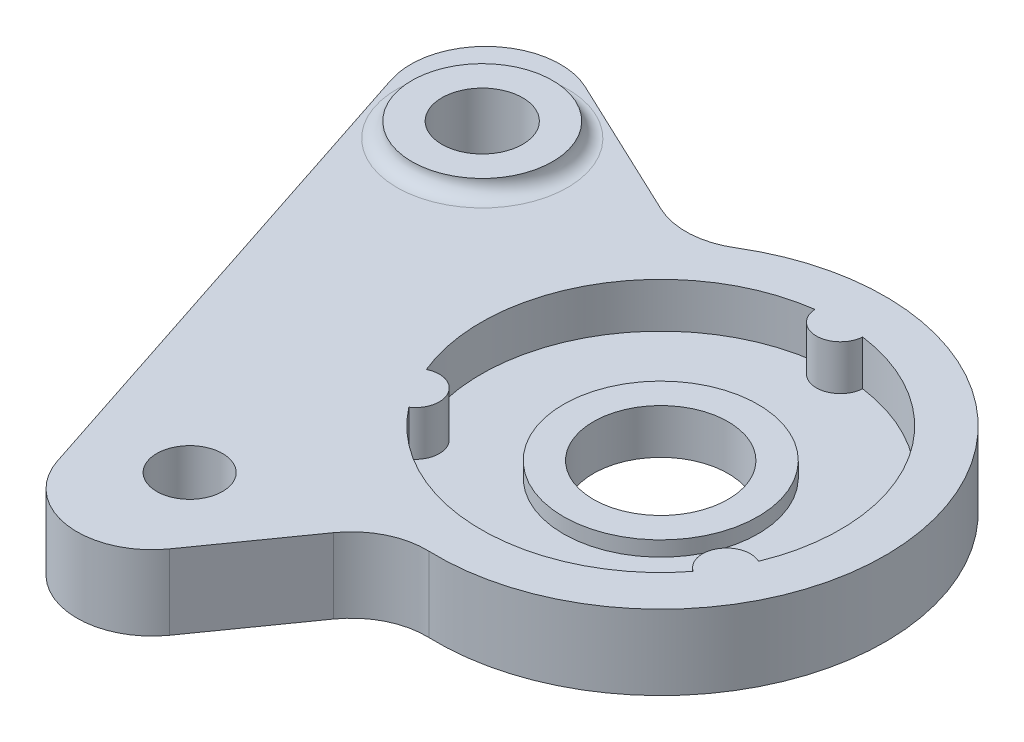
ISO-10303-21;
HEADER;
FILE_DESCRIPTION(('STEP AP214'),'2;1');
FILE_NAME('part.step','',(''),(''),'','','');
FILE_SCHEMA(('AUTOMOTIVE_DESIGN { 1 0 10303 214 1 1 1 1 }'));
ENDSEC;
DATA;
#1=APPLICATION_CONTEXT('core data for automotive mechanical design processes');
#2=APPLICATION_PROTOCOL_DEFINITION('international standard','automotive_design',2000,#1);
#3=PRODUCT_CONTEXT('',#1,'mechanical');
#4=PRODUCT('Part','Part','',(#3));
#5=PRODUCT_RELATED_PRODUCT_CATEGORY('part','',(#4));
#6=PRODUCT_DEFINITION_FORMATION('','',#4);
#7=PRODUCT_DEFINITION_CONTEXT('part definition',#1,'design');
#8=PRODUCT_DEFINITION('design','',#6,#7);
#9=PRODUCT_DEFINITION_SHAPE('','',#8);
#10=(LENGTH_UNIT() NAMED_UNIT(*) SI_UNIT(.MILLI.,.METRE.));
#11=(NAMED_UNIT(*) PLANE_ANGLE_UNIT() SI_UNIT($,.RADIAN.));
#12=(NAMED_UNIT(*) SI_UNIT($,.STERADIAN.) SOLID_ANGLE_UNIT());
#13=UNCERTAINTY_MEASURE_WITH_UNIT(LENGTH_MEASURE(1.E-05),#10,'distance_accuracy_value','');
#14=(GEOMETRIC_REPRESENTATION_CONTEXT(3) GLOBAL_UNCERTAINTY_ASSIGNED_CONTEXT((#13)) GLOBAL_UNIT_ASSIGNED_CONTEXT((#10,
#11,#12)) REPRESENTATION_CONTEXT('',''));
#15=CARTESIAN_POINT('',(0.,0.,0.));
#16=DIRECTION('',(0.,0.,1.));
#17=DIRECTION('',(1.,0.,0.));
#18=AXIS2_PLACEMENT_3D('',#15,#16,#17);
#19=CARTESIAN_POINT('',(0.,5.,0.));
#20=DIRECTION('',(0.,-1.,0.));
#21=DIRECTION('',(0.,0.,-1.));
#22=AXIS2_PLACEMENT_3D('',#19,#20,#21);
#23=CYLINDRICAL_SURFACE('',#22,12.);
#24=CARTESIAN_POINT('',(0.,5.,0.));
#25=DIRECTION('',(0.,1.,0.));
#26=DIRECTION('',(0.,0.,1.));
#27=AXIS2_PLACEMENT_3D('',#24,#25,#26);
#28=CIRCLE('',#27,12.);
#29=CARTESIAN_POINT('',(-1.59644048502354,5.,-11.8933333333333));
#30=VERTEX_POINT('',#29);
#31=CARTESIAN_POINT('',(-11.0981490448542,5.,4.56410865100746));
#32=VERTEX_POINT('',#31);
#33=EDGE_CURVE('E161',#30,#32,#28,.T.);
#34=ORIENTED_EDGE('',*,*,#33,.T.);
#35=DIRECTION('',(0.,-1.,0.));
#36=VECTOR('',#35,1.);
#37=CARTESIAN_POINT('',(-11.0981490448542,8.7279048689119,4.56410865100746));
#38=LINE('',#37,#36);
#39=CARTESIAN_POINT('',(-11.0981490448542,2.,4.56410865100746));
#40=VERTEX_POINT('',#39);
#41=EDGE_CURVE('E140',#32,#40,#38,.T.);
#42=ORIENTED_EDGE('',*,*,#41,.T.);
#43=CARTESIAN_POINT('',(0.,2.,0.));
#44=DIRECTION('',(0.,1.,0.));
#45=DIRECTION('',(0.,0.,1.));
#46=AXIS2_PLACEMENT_3D('',#43,#44,#45);
#47=CIRCLE('',#46,12.);
#48=CARTESIAN_POINT('',(-1.59644048502354,2.,-11.8933333333333));
#49=VERTEX_POINT('',#48);
#50=EDGE_CURVE('E200',#49,#40,#47,.T.);
#51=ORIENTED_EDGE('',*,*,#50,.F.);
#52=DIRECTION('',(0.,-1.,0.));
#53=VECTOR('',#52,1.);
#54=CARTESIAN_POINT('',(-1.59644048502354,8.7279048689119,-11.8933333333333));
#55=LINE('',#54,#53);
#56=EDGE_CURVE('E318',#30,#49,#55,.T.);
#57=ORIENTED_EDGE('',*,*,#56,.F.);
#58=EDGE_LOOP('',(#34,#42,#51,#57));
#59=FACE_BOUND('',#58,.T.);
#60=ADVANCED_FACE('F37',(#59),#23,.F.);
#61=CARTESIAN_POINT('',(-9.50170855983033,2.,7.32922468232806));
#62=VERTEX_POINT('',#61);
#63=CARTESIAN_POINT('',(9.50170855983194,2.,7.32922468232597));
#64=VERTEX_POINT('',#63);
#65=EDGE_CURVE('E154',#62,#64,#47,.T.);
#66=ORIENTED_EDGE('',*,*,#65,.F.);
#67=DIRECTION('',(0.,-1.,0.));
#68=VECTOR('',#67,1.);
#69=CARTESIAN_POINT('',(-9.50170855983033,8.7279048689119,7.32922468232806));
#70=LINE('',#69,#68);
#71=CARTESIAN_POINT('',(-9.50170855983033,5.,7.32922468232806));
#72=VERTEX_POINT('',#71);
#73=EDGE_CURVE('E52',#72,#62,#70,.T.);
#74=ORIENTED_EDGE('',*,*,#73,.F.);
#75=CARTESIAN_POINT('',(9.50170855983195,5.,7.32922468232596));
#76=VERTEX_POINT('',#75);
#77=EDGE_CURVE('E152',#72,#76,#28,.T.);
#78=ORIENTED_EDGE('',*,*,#77,.T.);
#79=DIRECTION('',(0.,-1.,0.));
#80=VECTOR('',#79,1.);
#81=CARTESIAN_POINT('',(9.50170855983194,8.7279048689119,7.32922468232597));
#82=LINE('',#81,#80);
#83=EDGE_CURVE('E145',#76,#64,#82,.T.);
#84=ORIENTED_EDGE('',*,*,#83,.T.);
#85=EDGE_LOOP('',(#66,#74,#78,#84));
#86=FACE_BOUND('',#85,.T.);
#87=ADVANCED_FACE('F150',(#86),#23,.F.);
#88=CARTESIAN_POINT('',(11.0981490448552,2.,4.56410865100517));
#89=VERTEX_POINT('',#88);
#90=CARTESIAN_POINT('',(1.59644048502354,2.,-11.8933333333333));
#91=VERTEX_POINT('',#90);
#92=EDGE_CURVE('E183',#89,#91,#47,.T.);
#93=ORIENTED_EDGE('',*,*,#92,.F.);
#94=DIRECTION('',(0.,-1.,0.));
#95=VECTOR('',#94,1.);
#96=CARTESIAN_POINT('',(11.0981490448552,8.7279048689119,4.56410865100517));
#97=LINE('',#96,#95);
#98=CARTESIAN_POINT('',(11.0981490448552,5.,4.56410865100517));
#99=VERTEX_POINT('',#98);
#100=EDGE_CURVE('E60',#99,#89,#97,.T.);
#101=ORIENTED_EDGE('',*,*,#100,.F.);
#102=CARTESIAN_POINT('',(1.59644048502355,5.,-11.8933333333333));
#103=VERTEX_POINT('',#102);
#104=EDGE_CURVE('E162',#99,#103,#28,.T.);
#105=ORIENTED_EDGE('',*,*,#104,.T.);
#106=DIRECTION('',(0.,-1.,0.));
#107=VECTOR('',#106,1.);
#108=CARTESIAN_POINT('',(1.59644048502354,8.7279048689119,-11.8933333333333));
#109=LINE('',#108,#107);
#110=EDGE_CURVE('E303',#103,#91,#109,.T.);
#111=ORIENTED_EDGE('',*,*,#110,.T.);
#112=EDGE_LOOP('',(#93,#101,#105,#111));
#113=FACE_BOUND('',#112,.T.);
#114=ADVANCED_FACE('F289',(#113),#23,.F.);
#115=CARTESIAN_POINT('',(4.89755338496311,5.,3.4661175458193));
#116=DIRECTION('',(0.816258897493851,0.,0.57768625763655));
#117=DIRECTION('',(0.57768625763655,0.,-0.816258897493851));
#118=AXIS2_PLACEMENT_3D('',#115,#116,#117);
#119=PLANE('',#118);
#120=DIRECTION('',(-0.57768625763655,0.,0.816258897493851));
#121=VECTOR('',#120,1.);
#122=CARTESIAN_POINT('',(4.89755338496311,0.,3.4661175458193));
#123=LINE('',#122,#121);
#124=CARTESIAN_POINT('',(-4.75170948953318,0.,17.1003291467469));
#125=VERTEX_POINT('',#124);
#126=CARTESIAN_POINT('',(-9.29348969687176,0.,23.5177719293896));
#127=VERTEX_POINT('',#126);
#128=EDGE_CURVE('E184',#125,#127,#123,.T.);
#129=ORIENTED_EDGE('',*,*,#128,.F.);
#130=DIRECTION('',(0.,-1.,0.));
#131=VECTOR('',#130,1.);
#132=CARTESIAN_POINT('',(-4.75170948953318,5.,17.1003291467469));
#133=LINE('',#132,#131);
#134=CARTESIAN_POINT('',(-4.75170948953318,5.,17.1003291467469));
#135=VERTEX_POINT('',#134);
#136=EDGE_CURVE('E230',#125,#135,#133,.F.);
#137=ORIENTED_EDGE('',*,*,#136,.T.);
#138=DIRECTION('',(-0.57768625763655,0.,0.816258897493851));
#139=VECTOR('',#138,1.);
#140=CARTESIAN_POINT('',(4.89755338496311,5.,3.4661175458193));
#141=LINE('',#140,#139);
#142=CARTESIAN_POINT('',(-9.29348969687176,5.,23.5177719293896));
#143=VERTEX_POINT('',#142);
#144=EDGE_CURVE('E164',#135,#143,#141,.T.);
#145=ORIENTED_EDGE('',*,*,#144,.T.);
#146=DIRECTION('',(0.,-1.,0.));
#147=VECTOR('',#146,1.);
#148=CARTESIAN_POINT('',(-9.29348969687176,5.,23.5177719293896));
#149=LINE('',#148,#147);
#150=EDGE_CURVE('E219',#143,#127,#149,.T.);
#151=ORIENTED_EDGE('',*,*,#150,.T.);
#152=EDGE_LOOP('',(#129,#137,#145,#151));
#153=FACE_BOUND('',#152,.T.);
#154=ADVANCED_FACE('F257',(#153),#119,.T.);
#155=CARTESIAN_POINT('',(0.,5.,0.));
#156=DIRECTION('',(0.,-1.,0.));
#157=DIRECTION('',(0.,0.,-1.));
#158=AXIS2_PLACEMENT_3D('',#155,#156,#157);
#159=CYLINDRICAL_SURFACE('',#158,15.);
#160=CARTESIAN_POINT('',(0.,0.,0.));
#161=DIRECTION('',(0.,1.,0.));
#162=DIRECTION('',(0.,0.,1.));
#163=AXIS2_PLACEMENT_3D('',#160,#161,#162);
#164=CIRCLE('',#163,15.);
#165=CARTESIAN_POINT('',(-0.502811251547942,0.,14.9915703261972));
#166=VERTEX_POINT('',#165);
#167=CARTESIAN_POINT('',(-7.8028543625734,0.,-12.8107557855292));
#168=VERTEX_POINT('',#167);
#169=EDGE_CURVE('E186',#166,#168,#164,.T.);
#170=ORIENTED_EDGE('',*,*,#169,.T.);
#171=DIRECTION('',(0.,-1.,0.));
#172=VECTOR('',#171,1.);
#173=CARTESIAN_POINT('',(-7.8028543625734,5.,-12.8107557855292));
#174=LINE('',#173,#172);
#175=CARTESIAN_POINT('',(-7.8028543625734,5.,-12.8107557855292));
#176=VERTEX_POINT('',#175);
#177=EDGE_CURVE('E228',#168,#176,#174,.F.);
#178=ORIENTED_EDGE('',*,*,#177,.T.);
#179=CARTESIAN_POINT('',(0.,5.,0.));
#180=DIRECTION('',(0.,1.,0.));
#181=DIRECTION('',(0.,0.,1.));
#182=AXIS2_PLACEMENT_3D('',#179,#180,#181);
#183=CIRCLE('',#182,15.);
#184=CARTESIAN_POINT('',(-0.502811251547942,5.,14.9915703261972));
#185=VERTEX_POINT('',#184);
#186=EDGE_CURVE('E171',#185,#176,#183,.T.);
#187=ORIENTED_EDGE('',*,*,#186,.F.);
#188=DIRECTION('',(0.,-1.,0.));
#189=VECTOR('',#188,1.);
#190=CARTESIAN_POINT('',(-0.502811251547942,5.,14.9915703261972));
#191=LINE('',#190,#189);
#192=EDGE_CURVE('E225',#185,#166,#191,.T.);
#193=ORIENTED_EDGE('',*,*,#192,.T.);
#194=EDGE_LOOP('',(#170,#178,#187,#193));
#195=FACE_BOUND('',#194,.T.);
#196=ADVANCED_FACE('F247',(#195),#159,.T.);
#197=CARTESIAN_POINT('',(2.56300821164913,5.,-5.42503353971376));
#198=DIRECTION('',(0.427168035274854,0.,-0.904172256618959));
#199=DIRECTION('',(-0.904172256618959,0.,-0.427168035274854));
#200=AXIS2_PLACEMENT_3D('',#197,#198,#199);
#201=PLANE('',#200);
#202=DIRECTION('',(0.904172256618959,0.,0.427168035274854));
#203=VECTOR('',#202,1.);
#204=CARTESIAN_POINT('',(2.56300821164913,5.,-5.42503353971376));
#205=LINE('',#204,#203);
#206=CARTESIAN_POINT('',(-22.1442331079006,5.,-17.097747067775));
#207=VERTEX_POINT('',#206);
#208=CARTESIAN_POINT('',(-12.5396459931388,5.,-12.5601464309441));
#209=VERTEX_POINT('',#208);
#210=EDGE_CURVE('E174',#207,#209,#205,.T.);
#211=ORIENTED_EDGE('',*,*,#210,.T.);
#212=DIRECTION('',(0.,-1.,0.));
#213=VECTOR('',#212,1.);
#214=CARTESIAN_POINT('',(-12.5396459931388,5.,-12.5601464309441));
#215=LINE('',#214,#213);
#216=CARTESIAN_POINT('',(-12.5396459931388,0.,-12.5601464309441));
#217=VERTEX_POINT('',#216);
#218=EDGE_CURVE('E222',#209,#217,#215,.T.);
#219=ORIENTED_EDGE('',*,*,#218,.T.);
#220=DIRECTION('',(0.904172256618959,0.,0.427168035274854));
#221=VECTOR('',#220,1.);
#222=CARTESIAN_POINT('',(2.56300821164913,0.,-5.42503353971376));
#223=LINE('',#222,#221);
#224=CARTESIAN_POINT('',(-22.1442331079006,0.,-17.097747067775));
#225=VERTEX_POINT('',#224);
#226=EDGE_CURVE('E189',#225,#217,#223,.T.);
#227=ORIENTED_EDGE('',*,*,#226,.F.);
#228=DIRECTION('',(0.,-1.,0.));
#229=VECTOR('',#228,1.);
#230=CARTESIAN_POINT('',(-22.1442331079006,5.,-17.097747067775));
#231=LINE('',#230,#229);
#232=EDGE_CURVE('E212',#225,#207,#231,.F.);
#233=ORIENTED_EDGE('',*,*,#232,.T.);
#234=EDGE_LOOP('',(#211,#219,#227,#233));
#235=FACE_BOUND('',#234,.T.);
#236=ADVANCED_FACE('F274',(#235),#201,.T.);
#237=CARTESIAN_POINT('',(-13.0441556974333,5.,18.4311259054112));
#238=DIRECTION('',(0.,-1.,0.));
#239=DIRECTION('',(0.,0.,-1.));
#240=AXIS2_PLACEMENT_3D('',#237,#238,#239);
#241=CYLINDRICAL_SURFACE('',#240,2.2);
#242=CARTESIAN_POINT('',(-13.0441556974333,5.,18.4311259054112));
#243=DIRECTION('',(0.,1.,0.));
#244=DIRECTION('',(0.,0.,1.));
#245=AXIS2_PLACEMENT_3D('',#242,#243,#244);
#246=CIRCLE('',#245,2.2);
#247=CARTESIAN_POINT('',(-13.0441556974333,5.,20.6311259054112));
#248=VERTEX_POINT('',#247);
#249=EDGE_CURVE('E180',#248,#248,#246,.T.);
#250=ORIENTED_EDGE('',*,*,#249,.T.);
#251=EDGE_LOOP('',(#250));
#252=FACE_BOUND('',#251,.T.);
#253=CARTESIAN_POINT('',(-13.0441556974333,0.,18.4311259054112));
#254=DIRECTION('',(0.,1.,0.));
#255=DIRECTION('',(0.,0.,1.));
#256=AXIS2_PLACEMENT_3D('',#253,#254,#255);
#257=CIRCLE('',#256,2.2);
#258=CARTESIAN_POINT('',(-13.0441556974333,0.,20.6311259054112));
#259=VERTEX_POINT('',#258);
#260=EDGE_CURVE('E195',#259,#259,#257,.T.);
#261=ORIENTED_EDGE('',*,*,#260,.F.);
#262=EDGE_LOOP('',(#261));
#263=FACE_BOUND('',#262,.T.);
#264=ADVANCED_FACE('F377',(#252,#263),#241,.F.);
#265=CARTESIAN_POINT('',(-22.9384223712889,5.,7.53322958914367));
#266=DIRECTION('',(-0.950076947783487,0.,0.31201569398095));
#267=DIRECTION('',(0.31201569398095,0.,0.950076947783487));
#268=AXIS2_PLACEMENT_3D('',#265,#266,#267);
#269=PLANE('',#268);
#270=DIRECTION('',(-0.31201569398095,0.,-0.950076947783487));
#271=VECTOR('',#270,1.);
#272=CARTESIAN_POINT('',(-22.9384223712889,5.,7.53322958914367));
#273=LINE('',#272,#271);
#274=CARTESIAN_POINT('',(-18.1251689232584,5.,22.1894191111116));
#275=VERTEX_POINT('',#274);
#276=CARTESIAN_POINT('',(-29.0304580231923,5.,-11.0168073147754));
#277=VERTEX_POINT('',#276);
#278=EDGE_CURVE('E177',#275,#277,#273,.T.);
#279=ORIENTED_EDGE('',*,*,#278,.T.);
#280=DIRECTION('',(0.,-1.,0.));
#281=VECTOR('',#280,1.);
#282=CARTESIAN_POINT('',(-29.0304580231923,5.,-11.0168073147754));
#283=LINE('',#282,#281);
#284=CARTESIAN_POINT('',(-29.0304580231923,0.,-11.0168073147754));
#285=VERTEX_POINT('',#284);
#286=EDGE_CURVE('E205',#277,#285,#283,.T.);
#287=ORIENTED_EDGE('',*,*,#286,.T.);
#288=DIRECTION('',(-0.31201569398095,0.,-0.950076947783487));
#289=VECTOR('',#288,1.);
#290=CARTESIAN_POINT('',(-22.9384223712889,0.,7.53322958914367));
#291=LINE('',#290,#289);
#292=CARTESIAN_POINT('',(-18.1251689232584,0.,22.1894191111116));
#293=VERTEX_POINT('',#292);
#294=EDGE_CURVE('E192',#293,#285,#291,.T.);
#295=ORIENTED_EDGE('',*,*,#294,.F.);
#296=DIRECTION('',(0.,-1.,0.));
#297=VECTOR('',#296,1.);
#298=CARTESIAN_POINT('',(-18.1251689232584,5.,22.1894191111116));
#299=LINE('',#298,#297);
#300=EDGE_CURVE('E203',#293,#275,#299,.F.);
#301=ORIENTED_EDGE('',*,*,#300,.T.);
#302=EDGE_LOOP('',(#279,#287,#295,#301));
#303=FACE_BOUND('',#302,.T.);
#304=ADVANCED_FACE('F265',(#303),#269,.T.);
#305=CARTESIAN_POINT('',(-22.604306415474,5.,-10.6792008818714));
#306=DIRECTION('',(0.,-1.,0.));
#307=DIRECTION('',(0.,0.,-1.));
#308=AXIS2_PLACEMENT_3D('',#305,#306,#307);
#309=CYLINDRICAL_SURFACE('',#308,2.7);
#310=CARTESIAN_POINT('',(-22.604306415474,0.,-10.6792008818714));
#311=DIRECTION('',(0.,1.,0.));
#312=DIRECTION('',(0.,0.,1.));
#313=AXIS2_PLACEMENT_3D('',#310,#311,#312);
#314=CIRCLE('',#313,2.7);
#315=CARTESIAN_POINT('',(-22.604306415474,0.,-7.97920088187135));
#316=VERTEX_POINT('',#315);
#317=EDGE_CURVE('E165',#316,#316,#314,.T.);
#318=ORIENTED_EDGE('',*,*,#317,.F.);
#319=EDGE_LOOP('',(#318));
#320=FACE_BOUND('',#319,.T.);
#321=CARTESIAN_POINT('',(-22.604306415474,6.,-10.6792008818714));
#322=DIRECTION('',(0.,1.,0.));
#323=DIRECTION('',(0.,0.,1.));
#324=AXIS2_PLACEMENT_3D('',#321,#322,#323);
#325=CIRCLE('',#324,2.7);
#326=CARTESIAN_POINT('',(-22.604306415474,6.,-7.97920088187135));
#327=VERTEX_POINT('',#326);
#328=EDGE_CURVE('E330',#327,#327,#325,.F.);
#329=ORIENTED_EDGE('',*,*,#328,.F.);
#330=EDGE_LOOP('',(#329));
#331=FACE_BOUND('',#330,.T.);
#332=ADVANCED_FACE('F370',(#320,#331),#309,.F.);
#333=CARTESIAN_POINT('',(0.,5.,0.));
#334=DIRECTION('',(0.,1.,0.));
#335=DIRECTION('',(0.,0.,1.));
#336=AXIS2_PLACEMENT_3D('',#333,#334,#335);
#337=PLANE('',#336);
#338=CARTESIAN_POINT('',(-22.604306415474,5.,-10.6792008818714));
#339=DIRECTION('',(0.,1.,0.));
#340=DIRECTION('',(0.,0.,1.));
#341=AXIS2_PLACEMENT_3D('',#338,#339,#340);
#342=CIRCLE('',#341,5.7);
#343=CARTESIAN_POINT('',(-22.604306415474,5.,-4.97920088187135));
#344=VERTEX_POINT('',#343);
#345=EDGE_CURVE('E11',#344,#344,#342,.F.);
#346=ORIENTED_EDGE('',*,*,#345,.T.);
#347=EDGE_LOOP('',(#346));
#348=FACE_BOUND('',#347,.T.);
#349=ORIENTED_EDGE('',*,*,#33,.F.);
#350=CARTESIAN_POINT('',(0.,5.,-12.));
#351=DIRECTION('',(0.,1.,0.));
#352=DIRECTION('',(0.,0.,1.));
#353=AXIS2_PLACEMENT_3D('',#350,#351,#352);
#354=CIRCLE('',#353,1.6);
#355=EDGE_CURVE('E317',#30,#103,#354,.T.);
#356=ORIENTED_EDGE('',*,*,#355,.T.);
#357=ORIENTED_EDGE('',*,*,#104,.F.);
#358=CARTESIAN_POINT('',(10.3923048454145,5.,5.99999999999926));
#359=DIRECTION('',(0.,1.,0.));
#360=DIRECTION('',(0.,0.,1.));
#361=AXIS2_PLACEMENT_3D('',#358,#359,#360);
#362=CIRCLE('',#361,1.6);
#363=EDGE_CURVE('E160',#99,#76,#362,.T.);
#364=ORIENTED_EDGE('',*,*,#363,.T.);
#365=ORIENTED_EDGE('',*,*,#77,.F.);
#366=CARTESIAN_POINT('',(-10.392304845412,5.,6.00000000000074));
#367=DIRECTION('',(0.,1.,0.));
#368=DIRECTION('',(0.,0.,1.));
#369=AXIS2_PLACEMENT_3D('',#366,#367,#368);
#370=CIRCLE('',#369,1.6);
#371=EDGE_CURVE('E137',#72,#32,#370,.T.);
#372=ORIENTED_EDGE('',*,*,#371,.T.);
#373=EDGE_LOOP('',(#349,#356,#357,#364,#365,#372));
#374=FACE_BOUND('',#373,.T.);
#375=ORIENTED_EDGE('',*,*,#210,.F.);
#376=CARTESIAN_POINT('',(-24.2800732842749,5.,-12.5768857846802));
#377=DIRECTION('',(0.,1.,0.));
#378=DIRECTION('',(0.,0.,1.));
#379=AXIS2_PLACEMENT_3D('',#376,#377,#378);
#380=CIRCLE('',#379,5.);
#381=EDGE_CURVE('E217',#207,#277,#380,.T.);
#382=ORIENTED_EDGE('',*,*,#381,.T.);
#383=ORIENTED_EDGE('',*,*,#278,.F.);
#384=CARTESIAN_POINT('',(-13.374784184341,5.,20.6293406412069));
#385=DIRECTION('',(0.,1.,0.));
#386=DIRECTION('',(0.,0.,1.));
#387=AXIS2_PLACEMENT_3D('',#384,#385,#386);
#388=CIRCLE('',#387,5.);
#389=EDGE_CURVE('E214',#275,#143,#388,.T.);
#390=ORIENTED_EDGE('',*,*,#389,.T.);
#391=ORIENTED_EDGE('',*,*,#144,.F.);
#392=CARTESIAN_POINT('',(-0.670415002063923,5.,19.9887604349296));
#393=DIRECTION('',(0.,1.,0.));
#394=DIRECTION('',(0.,0.,1.));
#395=AXIS2_PLACEMENT_3D('',#392,#393,#394);
#396=CIRCLE('',#395,5.);
#397=EDGE_CURVE('E45',#135,#185,#396,.F.);
#398=ORIENTED_EDGE('',*,*,#397,.T.);
#399=ORIENTED_EDGE('',*,*,#186,.T.);
#400=CARTESIAN_POINT('',(-10.4038058167645,5.,-17.0810077140389));
#401=DIRECTION('',(0.,1.,0.));
#402=DIRECTION('',(0.,0.,1.));
#403=AXIS2_PLACEMENT_3D('',#400,#401,#402);
#404=CIRCLE('',#403,5.);
#405=EDGE_CURVE('E234',#176,#209,#404,.F.);
#406=ORIENTED_EDGE('',*,*,#405,.T.);
#407=EDGE_LOOP('',(#375,#382,#383,#390,#391,#398,#399,#406));
#408=FACE_BOUND('',#407,.T.);
#409=ORIENTED_EDGE('',*,*,#249,.F.);
#410=EDGE_LOOP('',(#409));
#411=FACE_BOUND('',#410,.T.);
#412=ADVANCED_FACE('F157',(#348,#374,#408,#411),#337,.T.);
#413=CARTESIAN_POINT('',(0.,0.,0.));
#414=DIRECTION('',(0.,1.,0.));
#415=DIRECTION('',(0.,0.,1.));
#416=AXIS2_PLACEMENT_3D('',#413,#414,#415);
#417=PLANE('',#416);
#418=ORIENTED_EDGE('',*,*,#294,.T.);
#419=CARTESIAN_POINT('',(-24.2800732842749,0.,-12.5768857846802));
#420=DIRECTION('',(0.,1.,0.));
#421=DIRECTION('',(0.,0.,1.));
#422=AXIS2_PLACEMENT_3D('',#419,#420,#421);
#423=CIRCLE('',#422,5.);
#424=EDGE_CURVE('E210',#285,#225,#423,.F.);
#425=ORIENTED_EDGE('',*,*,#424,.T.);
#426=ORIENTED_EDGE('',*,*,#226,.T.);
#427=CARTESIAN_POINT('',(-10.4038058167645,0.,-17.0810077140389));
#428=DIRECTION('',(0.,1.,0.));
#429=DIRECTION('',(0.,0.,1.));
#430=AXIS2_PLACEMENT_3D('',#427,#428,#429);
#431=CIRCLE('',#430,5.);
#432=EDGE_CURVE('E232',#217,#168,#431,.T.);
#433=ORIENTED_EDGE('',*,*,#432,.T.);
#434=ORIENTED_EDGE('',*,*,#169,.F.);
#435=CARTESIAN_POINT('',(-0.670415002063923,0.,19.9887604349296));
#436=DIRECTION('',(0.,1.,0.));
#437=DIRECTION('',(0.,0.,1.));
#438=AXIS2_PLACEMENT_3D('',#435,#436,#437);
#439=CIRCLE('',#438,5.);
#440=EDGE_CURVE('E236',#166,#125,#439,.T.);
#441=ORIENTED_EDGE('',*,*,#440,.T.);
#442=ORIENTED_EDGE('',*,*,#128,.T.);
#443=CARTESIAN_POINT('',(-13.374784184341,0.,20.6293406412069));
#444=DIRECTION('',(0.,1.,0.));
#445=DIRECTION('',(0.,0.,1.));
#446=AXIS2_PLACEMENT_3D('',#443,#444,#445);
#447=CIRCLE('',#446,5.);
#448=EDGE_CURVE('E208',#127,#293,#447,.F.);
#449=ORIENTED_EDGE('',*,*,#448,.T.);
#450=EDGE_LOOP('',(#418,#425,#426,#433,#434,#441,#442,#449));
#451=FACE_BOUND('',#450,.T.);
#452=ORIENTED_EDGE('',*,*,#260,.T.);
#453=EDGE_LOOP('',(#452));
#454=FACE_BOUND('',#453,.T.);
#455=ORIENTED_EDGE('',*,*,#317,.T.);
#456=EDGE_LOOP('',(#455));
#457=FACE_BOUND('',#456,.T.);
#458=CARTESIAN_POINT('',(0.,0.,0.));
#459=DIRECTION('',(0.,1.,0.));
#460=DIRECTION('',(0.,0.,1.));
#461=AXIS2_PLACEMENT_3D('',#458,#459,#460);
#462=CIRCLE('',#461,4.5);
#463=CARTESIAN_POINT('',(0.,0.,4.5));
#464=VERTEX_POINT('',#463);
#465=EDGE_CURVE('E168',#464,#464,#462,.T.);
#466=ORIENTED_EDGE('',*,*,#465,.T.);
#467=EDGE_LOOP('',(#466));
#468=FACE_BOUND('',#467,.T.);
#469=ADVANCED_FACE('F253',(#451,#454,#457,#468),#417,.F.);
#470=CARTESIAN_POINT('',(0.,2.,0.));
#471=DIRECTION('',(0.,-1.,0.));
#472=DIRECTION('',(0.,0.,-1.));
#473=AXIS2_PLACEMENT_3D('',#470,#471,#472);
#474=CYLINDRICAL_SURFACE('',#473,4.5);
#475=ORIENTED_EDGE('',*,*,#465,.F.);
#476=EDGE_LOOP('',(#475));
#477=FACE_BOUND('',#476,.T.);
#478=CARTESIAN_POINT('',(0.,3.,0.));
#479=DIRECTION('',(0.,1.,0.));
#480=DIRECTION('',(0.,0.,1.));
#481=AXIS2_PLACEMENT_3D('',#478,#479,#480);
#482=CIRCLE('',#481,4.5);
#483=CARTESIAN_POINT('',(0.,3.,4.5));
#484=VERTEX_POINT('',#483);
#485=EDGE_CURVE('E324',#484,#484,#482,.F.);
#486=ORIENTED_EDGE('',*,*,#485,.F.);
#487=EDGE_LOOP('',(#486));
#488=FACE_BOUND('',#487,.T.);
#489=ADVANCED_FACE('F342',(#477,#488),#474,.F.);
#490=CARTESIAN_POINT('',(0.,2.,0.));
#491=DIRECTION('',(0.,1.,0.));
#492=DIRECTION('',(0.,0.,1.));
#493=AXIS2_PLACEMENT_3D('',#490,#491,#492);
#494=PLANE('',#493);
#495=CARTESIAN_POINT('',(0.,2.,0.));
#496=DIRECTION('',(0.,1.,0.));
#497=DIRECTION('',(0.,0.,1.));
#498=AXIS2_PLACEMENT_3D('',#495,#496,#497);
#499=CIRCLE('',#498,6.5);
#500=CARTESIAN_POINT('',(0.,2.,6.5));
#501=VERTEX_POINT('',#500);
#502=EDGE_CURVE('E321',#501,#501,#499,.T.);
#503=ORIENTED_EDGE('',*,*,#502,.F.);
#504=EDGE_LOOP('',(#503));
#505=FACE_BOUND('',#504,.T.);
#506=ORIENTED_EDGE('',*,*,#50,.T.);
#507=CARTESIAN_POINT('',(-10.392304845412,2.,6.00000000000074));
#508=DIRECTION('',(0.,1.,0.));
#509=DIRECTION('',(0.,0.,1.));
#510=AXIS2_PLACEMENT_3D('',#507,#508,#509);
#511=CIRCLE('',#510,1.6);
#512=EDGE_CURVE('E146',#62,#40,#511,.T.);
#513=ORIENTED_EDGE('',*,*,#512,.F.);
#514=ORIENTED_EDGE('',*,*,#65,.T.);
#515=CARTESIAN_POINT('',(10.3923048454145,2.,5.99999999999926));
#516=DIRECTION('',(0.,1.,0.));
#517=DIRECTION('',(0.,0.,1.));
#518=AXIS2_PLACEMENT_3D('',#515,#516,#517);
#519=CIRCLE('',#518,1.6);
#520=EDGE_CURVE('E308',#89,#64,#519,.T.);
#521=ORIENTED_EDGE('',*,*,#520,.F.);
#522=ORIENTED_EDGE('',*,*,#92,.T.);
#523=CARTESIAN_POINT('',(0.,2.,-12.));
#524=DIRECTION('',(0.,1.,0.));
#525=DIRECTION('',(0.,0.,1.));
#526=AXIS2_PLACEMENT_3D('',#523,#524,#525);
#527=CIRCLE('',#526,1.6);
#528=EDGE_CURVE('E315',#49,#91,#527,.T.);
#529=ORIENTED_EDGE('',*,*,#528,.F.);
#530=EDGE_LOOP('',(#506,#513,#514,#521,#522,#529));
#531=FACE_BOUND('',#530,.T.);
#532=ADVANCED_FACE('F307',(#505,#531),#494,.T.);
#533=CARTESIAN_POINT('',(-24.2800732842749,5.,-12.5768857846802));
#534=DIRECTION('',(0.,-1.,0.));
#535=DIRECTION('',(0.,0.,-1.));
#536=AXIS2_PLACEMENT_3D('',#533,#534,#535);
#537=CYLINDRICAL_SURFACE('',#536,5.);
#538=ORIENTED_EDGE('',*,*,#381,.F.);
#539=ORIENTED_EDGE('',*,*,#232,.F.);
#540=ORIENTED_EDGE('',*,*,#424,.F.);
#541=ORIENTED_EDGE('',*,*,#286,.F.);
#542=EDGE_LOOP('',(#538,#539,#540,#541));
#543=FACE_BOUND('',#542,.T.);
#544=ADVANCED_FACE('F270',(#543),#537,.T.);
#545=CARTESIAN_POINT('',(-13.374784184341,5.,20.6293406412069));
#546=DIRECTION('',(0.,-1.,0.));
#547=DIRECTION('',(0.,0.,-1.));
#548=AXIS2_PLACEMENT_3D('',#545,#546,#547);
#549=CYLINDRICAL_SURFACE('',#548,5.);
#550=ORIENTED_EDGE('',*,*,#389,.F.);
#551=ORIENTED_EDGE('',*,*,#300,.F.);
#552=ORIENTED_EDGE('',*,*,#448,.F.);
#553=ORIENTED_EDGE('',*,*,#150,.F.);
#554=EDGE_LOOP('',(#550,#551,#552,#553));
#555=FACE_BOUND('',#554,.T.);
#556=ADVANCED_FACE('F261',(#555),#549,.T.);
#557=CARTESIAN_POINT('',(-10.4038058167645,5.,-17.0810077140389));
#558=DIRECTION('',(0.,-1.,0.));
#559=DIRECTION('',(0.,0.,-1.));
#560=AXIS2_PLACEMENT_3D('',#557,#558,#559);
#561=CYLINDRICAL_SURFACE('',#560,5.);
#562=ORIENTED_EDGE('',*,*,#405,.F.);
#563=ORIENTED_EDGE('',*,*,#177,.F.);
#564=ORIENTED_EDGE('',*,*,#432,.F.);
#565=ORIENTED_EDGE('',*,*,#218,.F.);
#566=EDGE_LOOP('',(#562,#563,#564,#565));
#567=FACE_BOUND('',#566,.T.);
#568=ADVANCED_FACE('F277',(#567),#561,.F.);
#569=CARTESIAN_POINT('',(-0.670415002063923,5.,19.9887604349296));
#570=DIRECTION('',(0.,-1.,0.));
#571=DIRECTION('',(0.,0.,-1.));
#572=AXIS2_PLACEMENT_3D('',#569,#570,#571);
#573=CYLINDRICAL_SURFACE('',#572,5.);
#574=ORIENTED_EDGE('',*,*,#397,.F.);
#575=ORIENTED_EDGE('',*,*,#136,.F.);
#576=ORIENTED_EDGE('',*,*,#440,.F.);
#577=ORIENTED_EDGE('',*,*,#192,.F.);
#578=EDGE_LOOP('',(#574,#575,#576,#577));
#579=FACE_BOUND('',#578,.T.);
#580=ADVANCED_FACE('F250',(#579),#573,.F.);
#581=CARTESIAN_POINT('',(0.,6.,0.));
#582=DIRECTION('',(0.,1.,0.));
#583=DIRECTION('',(0.,0.,1.));
#584=AXIS2_PLACEMENT_3D('',#581,#582,#583);
#585=PLANE('',#584);
#586=ORIENTED_EDGE('',*,*,#328,.T.);
#587=EDGE_LOOP('',(#586));
#588=FACE_BOUND('',#587,.T.);
#589=CARTESIAN_POINT('',(-22.604306415474,6.,-10.6792008818714));
#590=DIRECTION('',(0.,1.,0.));
#591=DIRECTION('',(0.,0.,1.));
#592=AXIS2_PLACEMENT_3D('',#589,#590,#591);
#593=CIRCLE('',#592,4.7);
#594=CARTESIAN_POINT('',(-22.604306415474,6.,-5.97920088187135));
#595=VERTEX_POINT('',#594);
#596=EDGE_CURVE('E334',#595,#595,#593,.T.);
#597=ORIENTED_EDGE('',*,*,#596,.T.);
#598=EDGE_LOOP('',(#597));
#599=FACE_BOUND('',#598,.T.);
#600=ADVANCED_FACE('F284',(#588,#599),#585,.T.);
#601=CARTESIAN_POINT('',(-22.604306415474,6.,-10.6792008818714));
#602=DIRECTION('',(0.,1.,0.));
#603=DIRECTION('',(0.,0.,1.));
#604=AXIS2_PLACEMENT_3D('',#601,#602,#603);
#605=TOROIDAL_SURFACE('',#604,5.7,1.);
#606=ORIENTED_EDGE('',*,*,#345,.F.);
#607=EDGE_LOOP('',(#606));
#608=FACE_BOUND('',#607,.T.);
#609=ORIENTED_EDGE('',*,*,#596,.F.);
#610=EDGE_LOOP('',(#609));
#611=FACE_BOUND('',#610,.T.);
#612=ADVANCED_FACE('F39',(#608,#611),#605,.F.);
#613=CARTESIAN_POINT('',(0.,3.,0.));
#614=DIRECTION('',(0.,-1.,0.));
#615=DIRECTION('',(0.,0.,-1.));
#616=AXIS2_PLACEMENT_3D('',#613,#614,#615);
#617=CYLINDRICAL_SURFACE('',#616,6.5);
#618=CARTESIAN_POINT('',(0.,3.,0.));
#619=DIRECTION('',(0.,1.,0.));
#620=DIRECTION('',(0.,0.,1.));
#621=AXIS2_PLACEMENT_3D('',#618,#619,#620);
#622=CIRCLE('',#621,6.5);
#623=CARTESIAN_POINT('',(0.,3.,6.5));
#624=VERTEX_POINT('',#623);
#625=EDGE_CURVE('E327',#624,#624,#622,.T.);
#626=ORIENTED_EDGE('',*,*,#625,.F.);
#627=EDGE_LOOP('',(#626));
#628=FACE_BOUND('',#627,.T.);
#629=ORIENTED_EDGE('',*,*,#502,.T.);
#630=EDGE_LOOP('',(#629));
#631=FACE_BOUND('',#630,.T.);
#632=ADVANCED_FACE('F352',(#628,#631),#617,.T.);
#633=CARTESIAN_POINT('',(0.,3.,0.));
#634=DIRECTION('',(0.,1.,0.));
#635=DIRECTION('',(0.,0.,1.));
#636=AXIS2_PLACEMENT_3D('',#633,#634,#635);
#637=PLANE('',#636);
#638=ORIENTED_EDGE('',*,*,#485,.T.);
#639=EDGE_LOOP('',(#638));
#640=FACE_BOUND('',#639,.T.);
#641=ORIENTED_EDGE('',*,*,#625,.T.);
#642=EDGE_LOOP('',(#641));
#643=FACE_BOUND('',#642,.T.);
#644=ADVANCED_FACE('F348',(#640,#643),#637,.T.);
#645=CARTESIAN_POINT('',(0.,8.7279048689119,-12.));
#646=DIRECTION('',(0.,-1.,0.));
#647=DIRECTION('',(0.,0.,-1.));
#648=AXIS2_PLACEMENT_3D('',#645,#646,#647);
#649=CYLINDRICAL_SURFACE('',#648,1.6);
#650=ORIENTED_EDGE('',*,*,#355,.F.);
#651=ORIENTED_EDGE('',*,*,#56,.T.);
#652=ORIENTED_EDGE('',*,*,#528,.T.);
#653=ORIENTED_EDGE('',*,*,#110,.F.);
#654=EDGE_LOOP('',(#650,#651,#652,#653));
#655=FACE_BOUND('',#654,.T.);
#656=ADVANCED_FACE('F351',(#655),#649,.T.);
#657=CARTESIAN_POINT('',(10.3923048454145,8.7279048689119,5.99999999999926));
#658=DIRECTION('',(0.,-1.,0.));
#659=DIRECTION('',(0.,0.,-1.));
#660=AXIS2_PLACEMENT_3D('',#657,#658,#659);
#661=CYLINDRICAL_SURFACE('',#660,1.6);
#662=ORIENTED_EDGE('',*,*,#363,.F.);
#663=ORIENTED_EDGE('',*,*,#100,.T.);
#664=ORIENTED_EDGE('',*,*,#520,.T.);
#665=ORIENTED_EDGE('',*,*,#83,.F.);
#666=EDGE_LOOP('',(#662,#663,#664,#665));
#667=FACE_BOUND('',#666,.T.);
#668=ADVANCED_FACE('F309',(#667),#661,.T.);
#669=CARTESIAN_POINT('',(-10.392304845412,8.7279048689119,6.00000000000074));
#670=DIRECTION('',(0.,-1.,0.));
#671=DIRECTION('',(0.,0.,-1.));
#672=AXIS2_PLACEMENT_3D('',#669,#670,#671);
#673=CYLINDRICAL_SURFACE('',#672,1.6);
#674=ORIENTED_EDGE('',*,*,#371,.F.);
#675=ORIENTED_EDGE('',*,*,#73,.T.);
#676=ORIENTED_EDGE('',*,*,#512,.T.);
#677=ORIENTED_EDGE('',*,*,#41,.F.);
#678=EDGE_LOOP('',(#674,#675,#676,#677));
#679=FACE_BOUND('',#678,.T.);
#680=ADVANCED_FACE('F138',(#679),#673,.T.);
#681=CLOSED_SHELL('',(#60,#87,#114,#154,#196,#236,#264,#304,#332,#412,#469,#489,#532,#544,#556,
#568,#580,#600,#612,#632,#644,#656,#668,#680));
#682=MANIFOLD_SOLID_BREP('B2',#681);
#683=ADVANCED_BREP_SHAPE_REPRESENTATION('',(#18,#682),#14);
#684=SHAPE_DEFINITION_REPRESENTATION(#9,#683);
ENDSEC;
END-ISO-10303-21;
